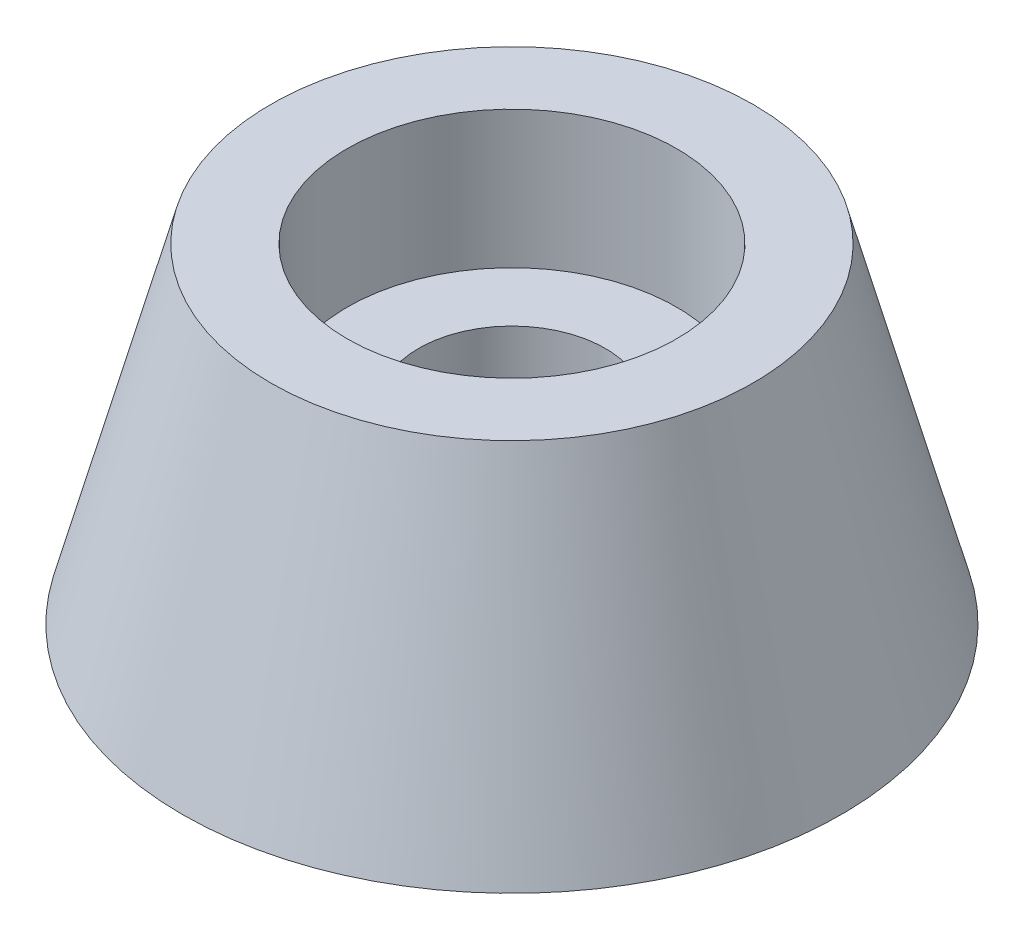
ISO-10303-21;
HEADER;
FILE_DESCRIPTION(('STEP AP214'),'2;1');
FILE_NAME('part.step','',(''),(''),'','','');
FILE_SCHEMA(('AUTOMOTIVE_DESIGN { 1 0 10303 214 1 1 1 1 }'));
ENDSEC;
DATA;
#1=APPLICATION_CONTEXT('core data for automotive mechanical design processes');
#2=APPLICATION_PROTOCOL_DEFINITION('international standard','automotive_design',2000,#1);
#3=PRODUCT_CONTEXT('',#1,'mechanical');
#4=PRODUCT('Part','Part','',(#3));
#5=PRODUCT_RELATED_PRODUCT_CATEGORY('part','',(#4));
#6=PRODUCT_DEFINITION_FORMATION('','',#4);
#7=PRODUCT_DEFINITION_CONTEXT('part definition',#1,'design');
#8=PRODUCT_DEFINITION('design','',#6,#7);
#9=PRODUCT_DEFINITION_SHAPE('','',#8);
#10=(LENGTH_UNIT() NAMED_UNIT(*) SI_UNIT(.MILLI.,.METRE.));
#11=(NAMED_UNIT(*) PLANE_ANGLE_UNIT() SI_UNIT($,.RADIAN.));
#12=(NAMED_UNIT(*) SI_UNIT($,.STERADIAN.) SOLID_ANGLE_UNIT());
#13=UNCERTAINTY_MEASURE_WITH_UNIT(LENGTH_MEASURE(1.E-05),#10,'distance_accuracy_value','');
#14=(GEOMETRIC_REPRESENTATION_CONTEXT(3) GLOBAL_UNCERTAINTY_ASSIGNED_CONTEXT((#13)) GLOBAL_UNIT_ASSIGNED_CONTEXT((#10,
#11,#12)) REPRESENTATION_CONTEXT('',''));
#15=CARTESIAN_POINT('',(0.,0.,0.));
#16=DIRECTION('',(0.,0.,1.));
#17=DIRECTION('',(1.,0.,0.));
#18=AXIS2_PLACEMENT_3D('',#15,#16,#17);
#19=CARTESIAN_POINT('',(0.,0.,0.));
#20=DIRECTION('',(0.,-1.,0.));
#21=DIRECTION('',(0.,0.,1.));
#22=AXIS2_PLACEMENT_3D('',#19,#20,#21);
#23=CONICAL_SURFACE('',#22,6.,0.261799387799149);
#24=CARTESIAN_POINT('',(0.,6.,0.));
#25=DIRECTION('',(0.,1.,0.));
#26=DIRECTION('',(0.,0.,1.));
#27=AXIS2_PLACEMENT_3D('',#24,#25,#26);
#28=CIRCLE('',#27,4.39230484541326);
#29=CARTESIAN_POINT('',(0.,6.,4.39230484541326));
#30=VERTEX_POINT('',#29);
#31=EDGE_CURVE('E11',#30,#30,#28,.T.);
#32=ORIENTED_EDGE('',*,*,#31,.F.);
#33=EDGE_LOOP('',(#32));
#34=FACE_BOUND('',#33,.T.);
#35=CARTESIAN_POINT('',(0.,0.,0.));
#36=DIRECTION('',(0.,1.,0.));
#37=DIRECTION('',(0.,0.,1.));
#38=AXIS2_PLACEMENT_3D('',#35,#36,#37);
#39=CIRCLE('',#38,6.);
#40=CARTESIAN_POINT('',(0.,0.,6.));
#41=VERTEX_POINT('',#40);
#42=EDGE_CURVE('E38',#41,#41,#39,.T.);
#43=ORIENTED_EDGE('',*,*,#42,.T.);
#44=EDGE_LOOP('',(#43));
#45=FACE_BOUND('',#44,.T.);
#46=ADVANCED_FACE('F32',(#34,#45),#23,.T.);
#47=CARTESIAN_POINT('',(0.,6.,0.));
#48=DIRECTION('',(0.,1.,0.));
#49=DIRECTION('',(0.,0.,1.));
#50=AXIS2_PLACEMENT_3D('',#47,#48,#49);
#51=PLANE('',#50);
#52=CARTESIAN_POINT('',(0.,6.,0.));
#53=DIRECTION('',(0.,1.,0.));
#54=DIRECTION('',(0.,0.,1.));
#55=AXIS2_PLACEMENT_3D('',#52,#53,#54);
#56=CIRCLE('',#55,3.);
#57=CARTESIAN_POINT('',(0.,6.,3.));
#58=VERTEX_POINT('',#57);
#59=EDGE_CURVE('E46',#58,#58,#56,.T.);
#60=ORIENTED_EDGE('',*,*,#59,.F.);
#61=EDGE_LOOP('',(#60));
#62=FACE_BOUND('',#61,.T.);
#63=ORIENTED_EDGE('',*,*,#31,.T.);
#64=EDGE_LOOP('',(#63));
#65=FACE_BOUND('',#64,.T.);
#66=ADVANCED_FACE('F73',(#62,#65),#51,.T.);
#67=CARTESIAN_POINT('',(0.,0.,0.));
#68=DIRECTION('',(0.,1.,0.));
#69=DIRECTION('',(0.,0.,1.));
#70=AXIS2_PLACEMENT_3D('',#67,#68,#69);
#71=PLANE('',#70);
#72=CARTESIAN_POINT('',(0.,0.,0.));
#73=DIRECTION('',(0.,1.,0.));
#74=DIRECTION('',(0.,0.,1.));
#75=AXIS2_PLACEMENT_3D('',#72,#73,#74);
#76=CIRCLE('',#75,1.7);
#77=CARTESIAN_POINT('',(0.,0.,1.7));
#78=VERTEX_POINT('',#77);
#79=EDGE_CURVE('E51',#78,#78,#76,.T.);
#80=ORIENTED_EDGE('',*,*,#79,.T.);
#81=EDGE_LOOP('',(#80));
#82=FACE_BOUND('',#81,.T.);
#83=ORIENTED_EDGE('',*,*,#42,.F.);
#84=EDGE_LOOP('',(#83));
#85=FACE_BOUND('',#84,.T.);
#86=ADVANCED_FACE('F69',(#82,#85),#71,.F.);
#87=CARTESIAN_POINT('',(0.,-8.48528137423857,0.));
#88=DIRECTION('',(0.,1.,0.));
#89=DIRECTION('',(0.,0.,1.));
#90=AXIS2_PLACEMENT_3D('',#87,#88,#89);
#91=CYLINDRICAL_SURFACE('',#90,3.);
#92=CARTESIAN_POINT('',(0.,3.5,0.));
#93=DIRECTION('',(0.,1.,0.));
#94=DIRECTION('',(0.,0.,1.));
#95=AXIS2_PLACEMENT_3D('',#92,#93,#94);
#96=CIRCLE('',#95,3.);
#97=CARTESIAN_POINT('',(0.,3.5,3.));
#98=VERTEX_POINT('',#97);
#99=EDGE_CURVE('E42',#98,#98,#96,.F.);
#100=CARTESIAN_POINT('',(0.,3.5,3.));
#101=CARTESIAN_POINT('',(0.,3.52604166666666,3.));
#102=CARTESIAN_POINT('',(0.,3.55208333333333,3.));
#103=CARTESIAN_POINT('',(0.,3.60416666666666,3.));
#104=CARTESIAN_POINT('',(0.,3.63020833333333,3.));
#105=CARTESIAN_POINT('',(0.,3.68229166666666,3.));
#106=CARTESIAN_POINT('',(0.,3.70833333333333,3.));
#107=CARTESIAN_POINT('',(0.,3.76041666666666,3.));
#108=CARTESIAN_POINT('',(0.,3.78645833333333,3.));
#109=CARTESIAN_POINT('',(0.,3.83854166666667,3.));
#110=CARTESIAN_POINT('',(0.,3.86458333333333,3.));
#111=CARTESIAN_POINT('',(0.,3.91666666666666,3.));
#112=CARTESIAN_POINT('',(0.,3.94270833333333,3.));
#113=CARTESIAN_POINT('',(0.,3.99479166666666,3.));
#114=CARTESIAN_POINT('',(0.,4.02083333333333,3.));
#115=CARTESIAN_POINT('',(0.,4.07291666666667,3.));
#116=CARTESIAN_POINT('',(0.,4.09895833333333,3.));
#117=CARTESIAN_POINT('',(0.,4.15104166666667,3.));
#118=CARTESIAN_POINT('',(0.,4.17708333333333,3.));
#119=CARTESIAN_POINT('',(0.,4.22916666666667,3.));
#120=CARTESIAN_POINT('',(0.,4.25520833333333,3.));
#121=CARTESIAN_POINT('',(0.,4.30729166666667,3.));
#122=CARTESIAN_POINT('',(0.,4.33333333333333,3.));
#123=CARTESIAN_POINT('',(0.,4.38541666666667,3.));
#124=CARTESIAN_POINT('',(0.,4.41145833333333,3.));
#125=CARTESIAN_POINT('',(0.,4.46354166666667,3.));
#126=CARTESIAN_POINT('',(0.,4.48958333333333,3.));
#127=CARTESIAN_POINT('',(0.,4.54166666666667,3.));
#128=CARTESIAN_POINT('',(0.,4.56770833333333,3.));
#129=CARTESIAN_POINT('',(0.,4.61979166666667,3.));
#130=CARTESIAN_POINT('',(0.,4.64583333333333,3.));
#131=CARTESIAN_POINT('',(0.,4.69791666666667,3.));
#132=CARTESIAN_POINT('',(0.,4.72395833333333,3.));
#133=CARTESIAN_POINT('',(0.,4.77604166666667,3.));
#134=CARTESIAN_POINT('',(0.,4.80208333333333,3.));
#135=CARTESIAN_POINT('',(0.,4.85416666666667,3.));
#136=CARTESIAN_POINT('',(0.,4.88020833333333,3.));
#137=CARTESIAN_POINT('',(0.,4.93229166666667,3.));
#138=CARTESIAN_POINT('',(0.,4.95833333333333,3.));
#139=CARTESIAN_POINT('',(0.,5.01041666666667,3.));
#140=CARTESIAN_POINT('',(0.,5.03645833333333,3.));
#141=CARTESIAN_POINT('',(0.,5.08854166666667,3.));
#142=CARTESIAN_POINT('',(0.,5.11458333333333,3.));
#143=CARTESIAN_POINT('',(0.,5.16666666666667,3.));
#144=CARTESIAN_POINT('',(0.,5.19270833333333,3.));
#145=CARTESIAN_POINT('',(0.,5.24479166666667,3.));
#146=CARTESIAN_POINT('',(0.,5.27083333333333,3.));
#147=CARTESIAN_POINT('',(0.,5.32291666666667,3.));
#148=CARTESIAN_POINT('',(0.,5.34895833333333,3.));
#149=CARTESIAN_POINT('',(0.,5.40104166666667,3.));
#150=CARTESIAN_POINT('',(0.,5.42708333333333,3.));
#151=CARTESIAN_POINT('',(0.,5.47916666666667,3.));
#152=CARTESIAN_POINT('',(0.,5.50520833333333,3.));
#153=CARTESIAN_POINT('',(0.,5.55729166666667,3.));
#154=CARTESIAN_POINT('',(0.,5.58333333333333,3.));
#155=CARTESIAN_POINT('',(0.,5.63541666666667,3.));
#156=CARTESIAN_POINT('',(0.,5.66145833333333,3.));
#157=CARTESIAN_POINT('',(0.,5.71354166666667,3.));
#158=CARTESIAN_POINT('',(0.,5.73958333333333,3.));
#159=CARTESIAN_POINT('',(0.,5.79166666666667,3.));
#160=CARTESIAN_POINT('',(0.,5.81770833333333,3.));
#161=CARTESIAN_POINT('',(0.,5.86979166666667,3.));
#162=CARTESIAN_POINT('',(0.,5.89583333333333,3.));
#163=CARTESIAN_POINT('',(0.,5.94791666666667,3.));
#164=CARTESIAN_POINT('',(0.,5.97395833333333,3.));
#165=CARTESIAN_POINT('',(0.,6.,3.));
#166=B_SPLINE_CURVE_WITH_KNOTS('',3,(#100,#101,#102,#103,#104,#105,#106,#107,#108,#109,#110,
#111,#112,#113,#114,#115,#116,#117,#118,#119,#120,#121,#122,#123,#124,#125,#126,#127,#128,#129,
#130,#131,#132,#133,#134,#135,#136,#137,#138,#139,#140,#141,#142,#143,#144,#145,#146,#147,#148,
#149,#150,#151,#152,#153,#154,#155,#156,#157,#158,#159,#160,#161,#162,#163,#164,#165),
.UNSPECIFIED.,.F.,.F.,(4,2,2,2,2,2,2,2,2,2,2,2,2,2,2,2,2,2,2,2,2,2,2,2,2,2,2,2,2,2,2,2,4),(0.,
0.0781250000000001,0.15625,0.234375,0.3125,0.390625,0.46875,0.546875,0.625000000000001,
0.703125000000001,0.781250000000001,0.859375000000001,0.937500000000001,1.015625,1.09375,
1.171875,1.25,1.328125,1.40625,1.484375,1.5625,1.640625,1.71875,1.796875,1.875,1.953125,2.03125,
2.109375,2.1875,2.265625,2.34375,2.421875,2.5),.UNSPECIFIED.);
#167=EDGE_CURVE('BSEAM63',#98,#58,#166,.T.);
#168=ORIENTED_EDGE('',*,*,#99,.T.);
#169=ORIENTED_EDGE('',*,*,#59,.T.);
#170=ORIENTED_EDGE('',*,*,#167,.T.);
#171=ORIENTED_EDGE('',*,*,#167,.F.);
#172=EDGE_LOOP('',(#168,#170,#169,#171));
#173=FACE_BOUND('',#172,.T.);
#174=ADVANCED_FACE('F63',(#173),#91,.F.);
#175=CARTESIAN_POINT('',(0.,3.5,0.));
#176=DIRECTION('',(0.,1.,0.));
#177=DIRECTION('',(0.,0.,1.));
#178=AXIS2_PLACEMENT_3D('',#175,#176,#177);
#179=PLANE('',#178);
#180=CARTESIAN_POINT('',(0.,3.5,0.));
#181=DIRECTION('',(0.,1.,0.));
#182=DIRECTION('',(0.,0.,1.));
#183=AXIS2_PLACEMENT_3D('',#180,#181,#182);
#184=CIRCLE('',#183,1.69999999999999);
#185=CARTESIAN_POINT('',(0.,3.5,1.69999999999999));
#186=VERTEX_POINT('',#185);
#187=EDGE_CURVE('E54',#186,#186,#184,.T.);
#188=ORIENTED_EDGE('',*,*,#187,.F.);
#189=EDGE_LOOP('',(#188));
#190=FACE_BOUND('',#189,.T.);
#191=ORIENTED_EDGE('',*,*,#99,.F.);
#192=EDGE_LOOP('',(#191));
#193=FACE_BOUND('',#192,.T.);
#194=ADVANCED_FACE('F60',(#190,#193),#179,.T.);
#195=CARTESIAN_POINT('',(0.,3.5,0.));
#196=DIRECTION('',(0.,1.,0.));
#197=DIRECTION('',(0.,0.,1.));
#198=AXIS2_PLACEMENT_3D('',#195,#196,#197);
#199=CYLINDRICAL_SURFACE('',#198,1.69999999999999);
#200=ORIENTED_EDGE('',*,*,#79,.F.);
#201=EDGE_LOOP('',(#200));
#202=FACE_BOUND('',#201,.T.);
#203=ORIENTED_EDGE('',*,*,#187,.T.);
#204=EDGE_LOOP('',(#203));
#205=FACE_BOUND('',#204,.T.);
#206=ADVANCED_FACE('F58',(#202,#205),#199,.F.);
#207=CLOSED_SHELL('',(#46,#66,#86,#174,#194,#206));
#208=MANIFOLD_SOLID_BREP('B2',#207);
#209=ADVANCED_BREP_SHAPE_REPRESENTATION('',(#18,#208),#14);
#210=SHAPE_DEFINITION_REPRESENTATION(#9,#209);
ENDSEC;
END-ISO-10303-21;
